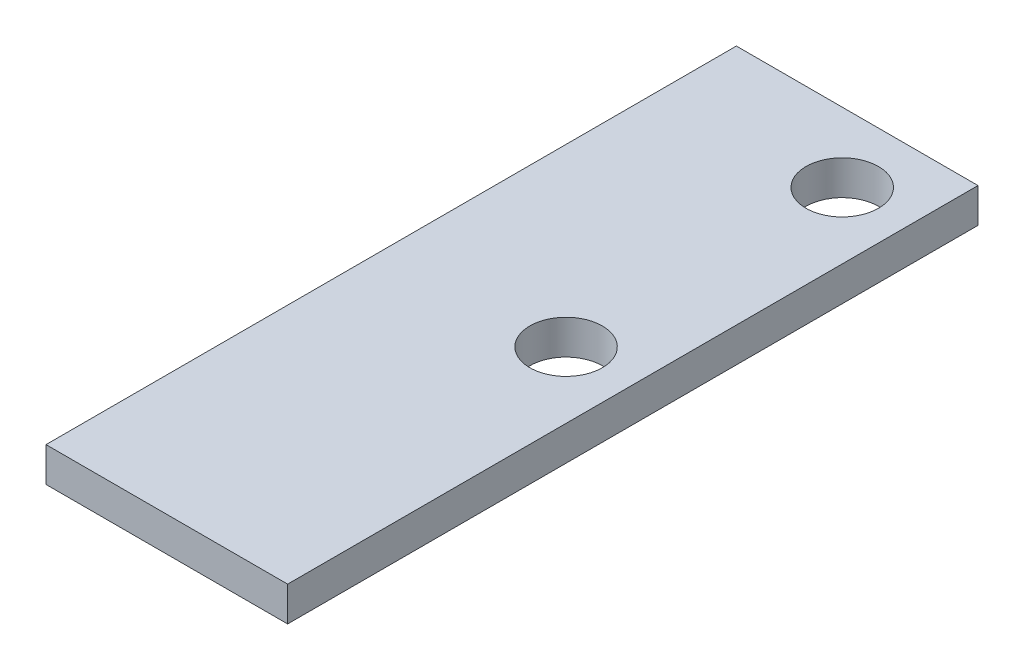
ISO-10303-21;
HEADER;
FILE_DESCRIPTION(('STEP AP214'),'2;1');
FILE_NAME('part.step','',(''),(''),'','','');
FILE_SCHEMA(('AUTOMOTIVE_DESIGN { 1 0 10303 214 1 1 1 1 }'));
ENDSEC;
DATA;
#1=APPLICATION_CONTEXT('core data for automotive mechanical design processes');
#2=APPLICATION_PROTOCOL_DEFINITION('international standard','automotive_design',2000,#1);
#3=PRODUCT_CONTEXT('',#1,'mechanical');
#4=PRODUCT('Part','Part','',(#3));
#5=PRODUCT_RELATED_PRODUCT_CATEGORY('part','',(#4));
#6=PRODUCT_DEFINITION_FORMATION('','',#4);
#7=PRODUCT_DEFINITION_CONTEXT('part definition',#1,'design');
#8=PRODUCT_DEFINITION('design','',#6,#7);
#9=PRODUCT_DEFINITION_SHAPE('','',#8);
#10=(LENGTH_UNIT() NAMED_UNIT(*) SI_UNIT(.MILLI.,.METRE.));
#11=(NAMED_UNIT(*) PLANE_ANGLE_UNIT() SI_UNIT($,.RADIAN.));
#12=(NAMED_UNIT(*) SI_UNIT($,.STERADIAN.) SOLID_ANGLE_UNIT());
#13=UNCERTAINTY_MEASURE_WITH_UNIT(LENGTH_MEASURE(1.E-05),#10,'distance_accuracy_value','');
#14=(GEOMETRIC_REPRESENTATION_CONTEXT(3) GLOBAL_UNCERTAINTY_ASSIGNED_CONTEXT((#13)) GLOBAL_UNIT_ASSIGNED_CONTEXT((#10,
#11,#12)) REPRESENTATION_CONTEXT('',''));
#15=CARTESIAN_POINT('',(0.,0.,0.));
#16=DIRECTION('',(0.,0.,1.));
#17=DIRECTION('',(1.,0.,0.));
#18=AXIS2_PLACEMENT_3D('',#15,#16,#17);
#19=CARTESIAN_POINT('',(0.,-19.75,-30.));
#20=DIRECTION('',(-1.,0.,0.));
#21=DIRECTION('',(0.,0.,1.));
#22=AXIS2_PLACEMENT_3D('',#19,#20,#21);
#23=PLANE('',#22);
#24=DIRECTION('',(0.,0.,-1.));
#25=VECTOR('',#24,1.);
#26=CARTESIAN_POINT('',(0.,-21.25,-30.));
#27=LINE('',#26,#25);
#28=CARTESIAN_POINT('',(0.,-21.25,0.));
#29=VERTEX_POINT('',#28);
#30=CARTESIAN_POINT('',(0.,-21.25,-30.));
#31=VERTEX_POINT('',#30);
#32=EDGE_CURVE('E98',#29,#31,#27,.T.);
#33=ORIENTED_EDGE('',*,*,#32,.F.);
#34=DIRECTION('',(0.,-1.,0.));
#35=VECTOR('',#34,1.);
#36=CARTESIAN_POINT('',(0.,-19.75,0.));
#37=LINE('',#36,#35);
#38=CARTESIAN_POINT('',(0.,-19.75,0.));
#39=VERTEX_POINT('',#38);
#40=EDGE_CURVE('E11',#39,#29,#37,.T.);
#41=ORIENTED_EDGE('',*,*,#40,.F.);
#42=DIRECTION('',(0.,0.,-1.));
#43=VECTOR('',#42,1.);
#44=CARTESIAN_POINT('',(0.,-19.75,-30.));
#45=LINE('',#44,#43);
#46=CARTESIAN_POINT('',(0.,-19.75,-30.));
#47=VERTEX_POINT('',#46);
#48=EDGE_CURVE('E91',#39,#47,#45,.T.);
#49=ORIENTED_EDGE('',*,*,#48,.T.);
#50=DIRECTION('',(0.,-1.,0.));
#51=VECTOR('',#50,1.);
#52=CARTESIAN_POINT('',(0.,-19.75,-30.));
#53=LINE('',#52,#51);
#54=EDGE_CURVE('E36',#47,#31,#53,.T.);
#55=ORIENTED_EDGE('',*,*,#54,.T.);
#56=EDGE_LOOP('',(#33,#41,#49,#55));
#57=FACE_BOUND('',#56,.T.);
#58=ADVANCED_FACE('F33',(#57),#23,.T.);
#59=CARTESIAN_POINT('',(0.,-19.75,0.));
#60=DIRECTION('',(0.,0.,1.));
#61=DIRECTION('',(1.,0.,0.));
#62=AXIS2_PLACEMENT_3D('',#59,#60,#61);
#63=PLANE('',#62);
#64=DIRECTION('',(-1.,0.,0.));
#65=VECTOR('',#64,1.);
#66=CARTESIAN_POINT('',(0.,-21.25,0.));
#67=LINE('',#66,#65);
#68=CARTESIAN_POINT('',(10.5,-21.25,0.));
#69=VERTEX_POINT('',#68);
#70=EDGE_CURVE('E93',#69,#29,#67,.T.);
#71=ORIENTED_EDGE('',*,*,#70,.F.);
#72=DIRECTION('',(0.,-1.,0.));
#73=VECTOR('',#72,1.);
#74=CARTESIAN_POINT('',(10.5,-19.75,0.));
#75=LINE('',#74,#73);
#76=CARTESIAN_POINT('',(10.5,-19.75,0.));
#77=VERTEX_POINT('',#76);
#78=EDGE_CURVE('E42',#77,#69,#75,.T.);
#79=ORIENTED_EDGE('',*,*,#78,.F.);
#80=DIRECTION('',(-1.,0.,0.));
#81=VECTOR('',#80,1.);
#82=CARTESIAN_POINT('',(0.,-19.75,0.));
#83=LINE('',#82,#81);
#84=EDGE_CURVE('E88',#77,#39,#83,.T.);
#85=ORIENTED_EDGE('',*,*,#84,.T.);
#86=ORIENTED_EDGE('',*,*,#40,.T.);
#87=EDGE_LOOP('',(#71,#79,#85,#86));
#88=FACE_BOUND('',#87,.T.);
#89=ADVANCED_FACE('F109',(#88),#63,.T.);
#90=CARTESIAN_POINT('',(10.5,-19.75,-30.));
#91=DIRECTION('',(1.,0.,0.));
#92=DIRECTION('',(0.,0.,-1.));
#93=AXIS2_PLACEMENT_3D('',#90,#91,#92);
#94=PLANE('',#93);
#95=DIRECTION('',(0.,0.,1.));
#96=VECTOR('',#95,1.);
#97=CARTESIAN_POINT('',(10.5,-21.25,-30.));
#98=LINE('',#97,#96);
#99=CARTESIAN_POINT('',(10.5,-21.25,-30.));
#100=VERTEX_POINT('',#99);
#101=EDGE_CURVE('E83',#100,#69,#98,.T.);
#102=ORIENTED_EDGE('',*,*,#101,.F.);
#103=DIRECTION('',(0.,-1.,0.));
#104=VECTOR('',#103,1.);
#105=CARTESIAN_POINT('',(10.5,-19.75,-30.));
#106=LINE('',#105,#104);
#107=CARTESIAN_POINT('',(10.5,-19.75,-30.));
#108=VERTEX_POINT('',#107);
#109=EDGE_CURVE('E78',#108,#100,#106,.T.);
#110=ORIENTED_EDGE('',*,*,#109,.F.);
#111=DIRECTION('',(0.,0.,1.));
#112=VECTOR('',#111,1.);
#113=CARTESIAN_POINT('',(10.5,-19.75,-30.));
#114=LINE('',#113,#112);
#115=EDGE_CURVE('E81',#108,#77,#114,.T.);
#116=ORIENTED_EDGE('',*,*,#115,.T.);
#117=ORIENTED_EDGE('',*,*,#78,.T.);
#118=EDGE_LOOP('',(#102,#110,#116,#117));
#119=FACE_BOUND('',#118,.T.);
#120=ADVANCED_FACE('F80',(#119),#94,.T.);
#121=CARTESIAN_POINT('',(0.,-19.75,-30.));
#122=DIRECTION('',(0.,0.,-1.));
#123=DIRECTION('',(-1.,0.,0.));
#124=AXIS2_PLACEMENT_3D('',#121,#122,#123);
#125=PLANE('',#124);
#126=DIRECTION('',(1.,0.,0.));
#127=VECTOR('',#126,1.);
#128=CARTESIAN_POINT('',(0.,-21.25,-30.));
#129=LINE('',#128,#127);
#130=EDGE_CURVE('E101',#31,#100,#129,.T.);
#131=ORIENTED_EDGE('',*,*,#130,.F.);
#132=ORIENTED_EDGE('',*,*,#54,.F.);
#133=DIRECTION('',(1.,0.,0.));
#134=VECTOR('',#133,1.);
#135=CARTESIAN_POINT('',(0.,-19.75,-30.));
#136=LINE('',#135,#134);
#137=EDGE_CURVE('E87',#47,#108,#136,.T.);
#138=ORIENTED_EDGE('',*,*,#137,.T.);
#139=ORIENTED_EDGE('',*,*,#109,.T.);
#140=EDGE_LOOP('',(#131,#132,#138,#139));
#141=FACE_BOUND('',#140,.T.);
#142=ADVANCED_FACE('F90',(#141),#125,.T.);
#143=CARTESIAN_POINT('',(0.,-19.75,0.));
#144=DIRECTION('',(0.,1.,0.));
#145=DIRECTION('',(0.,0.,1.));
#146=AXIS2_PLACEMENT_3D('',#143,#144,#145);
#147=PLANE('',#146);
#148=CARTESIAN_POINT('',(7.62,-19.75,-26.98));
#149=DIRECTION('',(0.,-1.,0.));
#150=DIRECTION('',(0.,0.,-1.));
#151=AXIS2_PLACEMENT_3D('',#148,#149,#150);
#152=CIRCLE('',#151,1.575);
#153=CARTESIAN_POINT('',(7.62,-19.75,-28.555));
#154=VERTEX_POINT('',#153);
#155=EDGE_CURVE('E142',#154,#154,#152,.T.);
#156=ORIENTED_EDGE('',*,*,#155,.T.);
#157=EDGE_LOOP('',(#156));
#158=FACE_BOUND('',#157,.T.);
#159=CARTESIAN_POINT('',(7.62,-19.75,-14.98));
#160=DIRECTION('',(0.,-1.,0.));
#161=DIRECTION('',(0.,0.,-1.));
#162=AXIS2_PLACEMENT_3D('',#159,#160,#161);
#163=CIRCLE('',#162,1.575);
#164=CARTESIAN_POINT('',(7.62,-19.75,-16.555));
#165=VERTEX_POINT('',#164);
#166=EDGE_CURVE('E102',#165,#165,#163,.T.);
#167=ORIENTED_EDGE('',*,*,#166,.T.);
#168=EDGE_LOOP('',(#167));
#169=FACE_BOUND('',#168,.T.);
#170=ORIENTED_EDGE('',*,*,#48,.F.);
#171=ORIENTED_EDGE('',*,*,#84,.F.);
#172=ORIENTED_EDGE('',*,*,#115,.F.);
#173=ORIENTED_EDGE('',*,*,#137,.F.);
#174=EDGE_LOOP('',(#170,#171,#172,#173));
#175=FACE_BOUND('',#174,.T.);
#176=ADVANCED_FACE('F86',(#158,#169,#175),#147,.T.);
#177=CARTESIAN_POINT('',(0.,-21.25,0.));
#178=DIRECTION('',(0.,1.,0.));
#179=DIRECTION('',(0.,0.,1.));
#180=AXIS2_PLACEMENT_3D('',#177,#178,#179);
#181=PLANE('',#180);
#182=CARTESIAN_POINT('',(7.62,-21.25,-26.98));
#183=DIRECTION('',(0.,-1.,0.));
#184=DIRECTION('',(0.,0.,-1.));
#185=AXIS2_PLACEMENT_3D('',#182,#183,#184);
#186=CIRCLE('',#185,1.575);
#187=CARTESIAN_POINT('',(7.62,-21.25,-28.555));
#188=VERTEX_POINT('',#187);
#189=EDGE_CURVE('E145',#188,#188,#186,.T.);
#190=ORIENTED_EDGE('',*,*,#189,.F.);
#191=EDGE_LOOP('',(#190));
#192=FACE_BOUND('',#191,.T.);
#193=CARTESIAN_POINT('',(7.62,-21.25,-14.98));
#194=DIRECTION('',(0.,-1.,0.));
#195=DIRECTION('',(0.,0.,-1.));
#196=AXIS2_PLACEMENT_3D('',#193,#194,#195);
#197=CIRCLE('',#196,1.575);
#198=CARTESIAN_POINT('',(7.62,-21.25,-16.555));
#199=VERTEX_POINT('',#198);
#200=EDGE_CURVE('E147',#199,#199,#197,.T.);
#201=ORIENTED_EDGE('',*,*,#200,.F.);
#202=EDGE_LOOP('',(#201));
#203=FACE_BOUND('',#202,.T.);
#204=ORIENTED_EDGE('',*,*,#32,.T.);
#205=ORIENTED_EDGE('',*,*,#130,.T.);
#206=ORIENTED_EDGE('',*,*,#101,.T.);
#207=ORIENTED_EDGE('',*,*,#70,.T.);
#208=EDGE_LOOP('',(#204,#205,#206,#207));
#209=FACE_BOUND('',#208,.T.);
#210=ADVANCED_FACE('F108',(#192,#203,#209),#181,.F.);
#211=CARTESIAN_POINT('',(7.62,-19.75,-14.98));
#212=DIRECTION('',(0.,-1.,0.));
#213=DIRECTION('',(0.,0.,-1.));
#214=AXIS2_PLACEMENT_3D('',#211,#212,#213);
#215=CYLINDRICAL_SURFACE('',#214,1.575);
#216=ORIENTED_EDGE('',*,*,#166,.F.);
#217=EDGE_LOOP('',(#216));
#218=FACE_BOUND('',#217,.T.);
#219=ORIENTED_EDGE('',*,*,#200,.T.);
#220=EDGE_LOOP('',(#219));
#221=FACE_BOUND('',#220,.T.);
#222=ADVANCED_FACE('F127',(#218,#221),#215,.F.);
#223=CARTESIAN_POINT('',(7.62,-19.75,-26.98));
#224=DIRECTION('',(0.,-1.,0.));
#225=DIRECTION('',(0.,0.,-1.));
#226=AXIS2_PLACEMENT_3D('',#223,#224,#225);
#227=CYLINDRICAL_SURFACE('',#226,1.575);
#228=ORIENTED_EDGE('',*,*,#155,.F.);
#229=EDGE_LOOP('',(#228));
#230=FACE_BOUND('',#229,.T.);
#231=ORIENTED_EDGE('',*,*,#189,.T.);
#232=EDGE_LOOP('',(#231));
#233=FACE_BOUND('',#232,.T.);
#234=ADVANCED_FACE('F134',(#230,#233),#227,.F.);
#235=CLOSED_SHELL('',(#58,#89,#120,#142,#176,#210,#222,#234));
#236=MANIFOLD_SOLID_BREP('B2',#235);
#237=ADVANCED_BREP_SHAPE_REPRESENTATION('',(#18,#236),#14);
#238=SHAPE_DEFINITION_REPRESENTATION(#9,#237);
ENDSEC;
END-ISO-10303-21;
